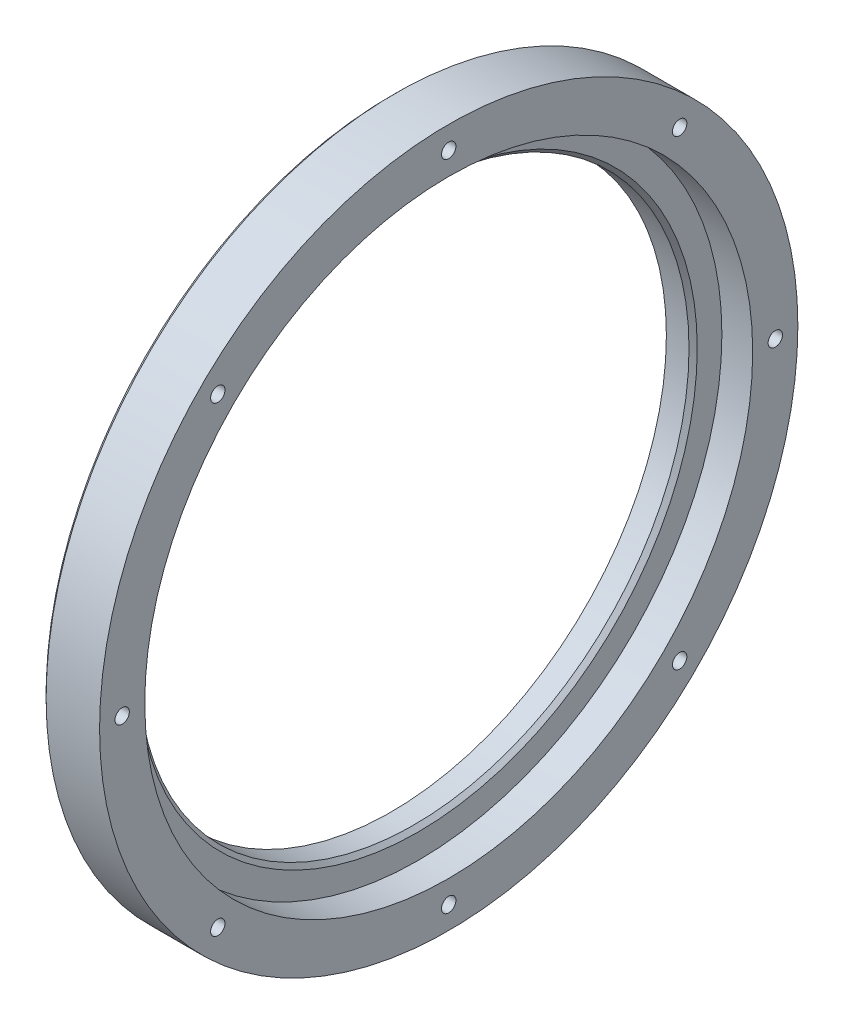
ISO-10303-21;
HEADER;
FILE_DESCRIPTION(('STEP AP214'),'2;1');
FILE_NAME('part.step','',(''),(''),'','','');
FILE_SCHEMA(('AUTOMOTIVE_DESIGN { 1 0 10303 214 1 1 1 1 }'));
ENDSEC;
DATA;
#1=APPLICATION_CONTEXT('core data for automotive mechanical design processes');
#2=APPLICATION_PROTOCOL_DEFINITION('international standard','automotive_design',2000,#1);
#3=PRODUCT_CONTEXT('',#1,'mechanical');
#4=PRODUCT('Part','Part','',(#3));
#5=PRODUCT_RELATED_PRODUCT_CATEGORY('part','',(#4));
#6=PRODUCT_DEFINITION_FORMATION('','',#4);
#7=PRODUCT_DEFINITION_CONTEXT('part definition',#1,'design');
#8=PRODUCT_DEFINITION('design','',#6,#7);
#9=PRODUCT_DEFINITION_SHAPE('','',#8);
#10=(LENGTH_UNIT() NAMED_UNIT(*) SI_UNIT(.MILLI.,.METRE.));
#11=(NAMED_UNIT(*) PLANE_ANGLE_UNIT() SI_UNIT($,.RADIAN.));
#12=(NAMED_UNIT(*) SI_UNIT($,.STERADIAN.) SOLID_ANGLE_UNIT());
#13=UNCERTAINTY_MEASURE_WITH_UNIT(LENGTH_MEASURE(1.E-05),#10,'distance_accuracy_value','');
#14=(GEOMETRIC_REPRESENTATION_CONTEXT(3) GLOBAL_UNCERTAINTY_ASSIGNED_CONTEXT((#13)) GLOBAL_UNIT_ASSIGNED_CONTEXT((#10,
#11,#12)) REPRESENTATION_CONTEXT('',''));
#15=CARTESIAN_POINT('',(0.,0.,0.));
#16=DIRECTION('',(0.,0.,1.));
#17=DIRECTION('',(1.,0.,0.));
#18=AXIS2_PLACEMENT_3D('',#15,#16,#17);
#19=CARTESIAN_POINT('',(-272.858046522507,57.2242590790327,56.2149891043305));
#20=DIRECTION('',(-1.,0.,0.));
#21=DIRECTION('',(0.,0.,1.));
#22=AXIS2_PLACEMENT_3D('',#19,#20,#21);
#23=CYLINDRICAL_SURFACE('',#22,1.75000000000001);
#24=CARTESIAN_POINT('',(-272.858046522507,57.2242590790327,56.2149891043305));
#25=DIRECTION('',(-1.,0.,0.));
#26=DIRECTION('',(0.,0.,1.));
#27=AXIS2_PLACEMENT_3D('',#24,#25,#26);
#28=CIRCLE('',#27,1.75000000000001);
#29=CARTESIAN_POINT('',(-272.858046522507,57.2242590790327,57.9649891043306));
#30=VERTEX_POINT('',#29);
#31=EDGE_CURVE('E116',#30,#30,#28,.T.);
#32=ORIENTED_EDGE('',*,*,#31,.F.);
#33=EDGE_LOOP('',(#32));
#34=FACE_BOUND('',#33,.T.);
#35=CARTESIAN_POINT('',(-282.871214875946,57.2242590790327,56.2149891043305));
#36=DIRECTION('',(-1.,0.,0.));
#37=DIRECTION('',(0.,0.,1.));
#38=AXIS2_PLACEMENT_3D('',#35,#36,#37);
#39=CIRCLE('',#38,1.75000000000001);
#40=CARTESIAN_POINT('',(-282.871214875946,57.2242590790327,57.9649891043306));
#41=VERTEX_POINT('',#40);
#42=EDGE_CURVE('E72',#41,#41,#39,.F.);
#43=ORIENTED_EDGE('',*,*,#42,.F.);
#44=EDGE_LOOP('',(#43));
#45=FACE_BOUND('',#44,.T.);
#46=ADVANCED_FACE('F48',(#34,#45),#23,.F.);
#47=CARTESIAN_POINT('',(-272.858046522507,80.5092699747022,0.));
#48=DIRECTION('',(-1.,0.,0.));
#49=DIRECTION('',(0.,0.,1.));
#50=AXIS2_PLACEMENT_3D('',#47,#48,#49);
#51=CYLINDRICAL_SURFACE('',#50,1.75000000000001);
#52=CARTESIAN_POINT('',(-272.858046522507,80.5092699747022,0.));
#53=DIRECTION('',(-1.,0.,0.));
#54=DIRECTION('',(0.,0.,1.));
#55=AXIS2_PLACEMENT_3D('',#52,#53,#54);
#56=CIRCLE('',#55,1.75000000000001);
#57=CARTESIAN_POINT('',(-272.858046522507,80.5092699747022,1.75000000000001));
#58=VERTEX_POINT('',#57);
#59=EDGE_CURVE('E162',#58,#58,#56,.T.);
#60=ORIENTED_EDGE('',*,*,#59,.F.);
#61=EDGE_LOOP('',(#60));
#62=FACE_BOUND('',#61,.T.);
#63=CARTESIAN_POINT('',(-282.871214875946,80.5092699747022,0.));
#64=DIRECTION('',(-1.,0.,0.));
#65=DIRECTION('',(0.,0.,1.));
#66=AXIS2_PLACEMENT_3D('',#63,#64,#65);
#67=CIRCLE('',#66,1.75000000000001);
#68=CARTESIAN_POINT('',(-282.871214875946,80.5092699747022,1.75000000000001));
#69=VERTEX_POINT('',#68);
#70=EDGE_CURVE('E77',#69,#69,#67,.F.);
#71=ORIENTED_EDGE('',*,*,#70,.F.);
#72=EDGE_LOOP('',(#71));
#73=FACE_BOUND('',#72,.T.);
#74=ADVANCED_FACE('F283',(#62,#73),#51,.F.);
#75=CARTESIAN_POINT('',(-272.858046522507,57.2242590790327,-56.2149891043305));
#76=DIRECTION('',(-1.,0.,0.));
#77=DIRECTION('',(0.,0.,1.));
#78=AXIS2_PLACEMENT_3D('',#75,#76,#77);
#79=CYLINDRICAL_SURFACE('',#78,1.75000000000001);
#80=CARTESIAN_POINT('',(-272.858046522507,57.2242590790327,-56.2149891043305));
#81=DIRECTION('',(-1.,0.,0.));
#82=DIRECTION('',(0.,0.,1.));
#83=AXIS2_PLACEMENT_3D('',#80,#81,#82);
#84=CIRCLE('',#83,1.75000000000001);
#85=CARTESIAN_POINT('',(-272.858046522507,57.2242590790327,-54.4649891043305));
#86=VERTEX_POINT('',#85);
#87=EDGE_CURVE('E158',#86,#86,#84,.T.);
#88=ORIENTED_EDGE('',*,*,#87,.F.);
#89=EDGE_LOOP('',(#88));
#90=FACE_BOUND('',#89,.T.);
#91=CARTESIAN_POINT('',(-282.871214875946,57.2242590790327,-56.2149891043305));
#92=DIRECTION('',(-1.,0.,0.));
#93=DIRECTION('',(0.,0.,1.));
#94=AXIS2_PLACEMENT_3D('',#91,#92,#93);
#95=CIRCLE('',#94,1.75000000000001);
#96=CARTESIAN_POINT('',(-282.871214875946,57.2242590790327,-54.4649891043305));
#97=VERTEX_POINT('',#96);
#98=EDGE_CURVE('E83',#97,#97,#95,.F.);
#99=ORIENTED_EDGE('',*,*,#98,.F.);
#100=EDGE_LOOP('',(#99));
#101=FACE_BOUND('',#100,.T.);
#102=ADVANCED_FACE('F289',(#90,#101),#79,.F.);
#103=CARTESIAN_POINT('',(-272.858046522507,1.00926997470218,-79.5));
#104=DIRECTION('',(-1.,0.,0.));
#105=DIRECTION('',(0.,0.,1.));
#106=AXIS2_PLACEMENT_3D('',#103,#104,#105);
#107=CYLINDRICAL_SURFACE('',#106,1.75);
#108=CARTESIAN_POINT('',(-272.858046522507,1.00926997470218,-79.5));
#109=DIRECTION('',(-1.,0.,0.));
#110=DIRECTION('',(0.,0.,1.));
#111=AXIS2_PLACEMENT_3D('',#108,#109,#110);
#112=CIRCLE('',#111,1.75);
#113=CARTESIAN_POINT('',(-272.858046522507,1.00926997470218,-77.75));
#114=VERTEX_POINT('',#113);
#115=EDGE_CURVE('E154',#114,#114,#112,.T.);
#116=ORIENTED_EDGE('',*,*,#115,.F.);
#117=EDGE_LOOP('',(#116));
#118=FACE_BOUND('',#117,.T.);
#119=CARTESIAN_POINT('',(-282.871214875946,1.00926997470218,-79.5));
#120=DIRECTION('',(-1.,0.,0.));
#121=DIRECTION('',(0.,0.,1.));
#122=AXIS2_PLACEMENT_3D('',#119,#120,#121);
#123=CIRCLE('',#122,1.75);
#124=CARTESIAN_POINT('',(-282.871214875946,1.00926997470218,-77.75));
#125=VERTEX_POINT('',#124);
#126=EDGE_CURVE('E89',#125,#125,#123,.F.);
#127=ORIENTED_EDGE('',*,*,#126,.F.);
#128=EDGE_LOOP('',(#127));
#129=FACE_BOUND('',#128,.T.);
#130=ADVANCED_FACE('F300',(#118,#129),#107,.F.);
#131=CARTESIAN_POINT('',(-272.858046522507,-55.2057191296284,-56.2149891043306));
#132=DIRECTION('',(-1.,0.,0.));
#133=DIRECTION('',(0.,0.,1.));
#134=AXIS2_PLACEMENT_3D('',#131,#132,#133);
#135=CYLINDRICAL_SURFACE('',#134,1.75000000000001);
#136=CARTESIAN_POINT('',(-272.858046522507,-55.2057191296284,-56.2149891043306));
#137=DIRECTION('',(-1.,0.,0.));
#138=DIRECTION('',(0.,0.,1.));
#139=AXIS2_PLACEMENT_3D('',#136,#137,#138);
#140=CIRCLE('',#139,1.75000000000001);
#141=CARTESIAN_POINT('',(-272.858046522507,-55.2057191296284,-54.4649891043305));
#142=VERTEX_POINT('',#141);
#143=EDGE_CURVE('E150',#142,#142,#140,.T.);
#144=ORIENTED_EDGE('',*,*,#143,.F.);
#145=EDGE_LOOP('',(#144));
#146=FACE_BOUND('',#145,.T.);
#147=CARTESIAN_POINT('',(-282.871214875946,-55.2057191296284,-56.2149891043306));
#148=DIRECTION('',(-1.,0.,0.));
#149=DIRECTION('',(0.,0.,1.));
#150=AXIS2_PLACEMENT_3D('',#147,#148,#149);
#151=CIRCLE('',#150,1.75000000000001);
#152=CARTESIAN_POINT('',(-282.871214875946,-55.2057191296284,-54.4649891043305));
#153=VERTEX_POINT('',#152);
#154=EDGE_CURVE('E95',#153,#153,#151,.F.);
#155=ORIENTED_EDGE('',*,*,#154,.F.);
#156=EDGE_LOOP('',(#155));
#157=FACE_BOUND('',#156,.T.);
#158=ADVANCED_FACE('F304',(#146,#157),#135,.F.);
#159=CARTESIAN_POINT('',(-272.858046522507,-78.4907300252979,0.));
#160=DIRECTION('',(-1.,0.,0.));
#161=DIRECTION('',(0.,0.,1.));
#162=AXIS2_PLACEMENT_3D('',#159,#160,#161);
#163=CYLINDRICAL_SURFACE('',#162,1.75000000000001);
#164=CARTESIAN_POINT('',(-272.858046522507,-78.4907300252979,0.));
#165=DIRECTION('',(-1.,0.,0.));
#166=DIRECTION('',(0.,0.,1.));
#167=AXIS2_PLACEMENT_3D('',#164,#165,#166);
#168=CIRCLE('',#167,1.75000000000001);
#169=CARTESIAN_POINT('',(-272.858046522507,-78.4907300252979,1.75));
#170=VERTEX_POINT('',#169);
#171=EDGE_CURVE('E146',#170,#170,#168,.T.);
#172=ORIENTED_EDGE('',*,*,#171,.F.);
#173=EDGE_LOOP('',(#172));
#174=FACE_BOUND('',#173,.T.);
#175=CARTESIAN_POINT('',(-282.871214875946,-78.4907300252979,0.));
#176=DIRECTION('',(-1.,0.,0.));
#177=DIRECTION('',(0.,0.,1.));
#178=AXIS2_PLACEMENT_3D('',#175,#176,#177);
#179=CIRCLE('',#178,1.75000000000001);
#180=CARTESIAN_POINT('',(-282.871214875946,-78.4907300252979,1.75));
#181=VERTEX_POINT('',#180);
#182=EDGE_CURVE('E101',#181,#181,#179,.F.);
#183=ORIENTED_EDGE('',*,*,#182,.F.);
#184=EDGE_LOOP('',(#183));
#185=FACE_BOUND('',#184,.T.);
#186=ADVANCED_FACE('F308',(#174,#185),#163,.F.);
#187=CARTESIAN_POINT('',(-272.858046522507,-55.2057191296284,56.2149891043305));
#188=DIRECTION('',(-1.,0.,0.));
#189=DIRECTION('',(0.,0.,1.));
#190=AXIS2_PLACEMENT_3D('',#187,#188,#189);
#191=CYLINDRICAL_SURFACE('',#190,1.75000000000001);
#192=CARTESIAN_POINT('',(-272.858046522507,-55.2057191296284,56.2149891043305));
#193=DIRECTION('',(-1.,0.,0.));
#194=DIRECTION('',(0.,0.,1.));
#195=AXIS2_PLACEMENT_3D('',#192,#193,#194);
#196=CIRCLE('',#195,1.75000000000001);
#197=CARTESIAN_POINT('',(-272.858046522507,-55.2057191296284,57.9649891043306));
#198=VERTEX_POINT('',#197);
#199=EDGE_CURVE('E142',#198,#198,#196,.T.);
#200=ORIENTED_EDGE('',*,*,#199,.F.);
#201=EDGE_LOOP('',(#200));
#202=FACE_BOUND('',#201,.T.);
#203=CARTESIAN_POINT('',(-282.871214875946,-55.2057191296284,56.2149891043305));
#204=DIRECTION('',(-1.,0.,0.));
#205=DIRECTION('',(0.,0.,1.));
#206=AXIS2_PLACEMENT_3D('',#203,#204,#205);
#207=CIRCLE('',#206,1.75000000000001);
#208=CARTESIAN_POINT('',(-282.871214875946,-55.2057191296284,57.9649891043306));
#209=VERTEX_POINT('',#208);
#210=EDGE_CURVE('E107',#209,#209,#207,.F.);
#211=ORIENTED_EDGE('',*,*,#210,.F.);
#212=EDGE_LOOP('',(#211));
#213=FACE_BOUND('',#212,.T.);
#214=ADVANCED_FACE('F312',(#202,#213),#191,.F.);
#215=CARTESIAN_POINT('',(-272.858046522507,1.00926997470216,79.5));
#216=DIRECTION('',(-1.,0.,0.));
#217=DIRECTION('',(0.,0.,1.));
#218=AXIS2_PLACEMENT_3D('',#215,#216,#217);
#219=CYLINDRICAL_SURFACE('',#218,1.75000000000001);
#220=CARTESIAN_POINT('',(-272.858046522507,1.00926997470216,79.5));
#221=DIRECTION('',(-1.,0.,0.));
#222=DIRECTION('',(0.,0.,1.));
#223=AXIS2_PLACEMENT_3D('',#220,#221,#222);
#224=CIRCLE('',#223,1.75000000000001);
#225=CARTESIAN_POINT('',(-272.858046522507,1.00926997470216,81.25));
#226=VERTEX_POINT('',#225);
#227=EDGE_CURVE('E138',#226,#226,#224,.T.);
#228=ORIENTED_EDGE('',*,*,#227,.F.);
#229=EDGE_LOOP('',(#228));
#230=FACE_BOUND('',#229,.T.);
#231=CARTESIAN_POINT('',(-282.871214875946,1.00926997470216,79.5));
#232=DIRECTION('',(-1.,0.,0.));
#233=DIRECTION('',(0.,0.,1.));
#234=AXIS2_PLACEMENT_3D('',#231,#232,#233);
#235=CIRCLE('',#234,1.75000000000001);
#236=CARTESIAN_POINT('',(-282.871214875946,1.00926997470216,81.25));
#237=VERTEX_POINT('',#236);
#238=EDGE_CURVE('E113',#237,#237,#235,.F.);
#239=ORIENTED_EDGE('',*,*,#238,.F.);
#240=EDGE_LOOP('',(#239));
#241=FACE_BOUND('',#240,.T.);
#242=ADVANCED_FACE('F266',(#230,#241),#219,.F.);
#243=CARTESIAN_POINT('',(-272.858046522507,75.0092699747022,0.));
#244=DIRECTION('',(1.,0.,0.));
#245=DIRECTION('',(0.,0.,-1.));
#246=AXIS2_PLACEMENT_3D('',#243,#244,#245);
#247=PLANE('',#246);
#248=ORIENTED_EDGE('',*,*,#31,.T.);
#249=EDGE_LOOP('',(#248));
#250=FACE_BOUND('',#249,.T.);
#251=ORIENTED_EDGE('',*,*,#59,.T.);
#252=EDGE_LOOP('',(#251));
#253=FACE_BOUND('',#252,.T.);
#254=ORIENTED_EDGE('',*,*,#87,.T.);
#255=EDGE_LOOP('',(#254));
#256=FACE_BOUND('',#255,.T.);
#257=ORIENTED_EDGE('',*,*,#115,.T.);
#258=EDGE_LOOP('',(#257));
#259=FACE_BOUND('',#258,.T.);
#260=ORIENTED_EDGE('',*,*,#143,.T.);
#261=EDGE_LOOP('',(#260));
#262=FACE_BOUND('',#261,.T.);
#263=ORIENTED_EDGE('',*,*,#171,.T.);
#264=EDGE_LOOP('',(#263));
#265=FACE_BOUND('',#264,.T.);
#266=ORIENTED_EDGE('',*,*,#199,.T.);
#267=EDGE_LOOP('',(#266));
#268=FACE_BOUND('',#267,.T.);
#269=ORIENTED_EDGE('',*,*,#227,.T.);
#270=EDGE_LOOP('',(#269));
#271=FACE_BOUND('',#270,.T.);
#272=CARTESIAN_POINT('',(-272.858046522507,1.00926997470217,0.));
#273=DIRECTION('',(1.,0.,0.));
#274=DIRECTION('',(0.,0.,-1.));
#275=AXIS2_PLACEMENT_3D('',#272,#273,#274);
#276=CIRCLE('',#275,85.);
#277=CARTESIAN_POINT('',(-272.858046522507,1.00926997470217,-85.));
#278=VERTEX_POINT('',#277);
#279=EDGE_CURVE('E134',#278,#278,#276,.T.);
#280=ORIENTED_EDGE('',*,*,#279,.T.);
#281=EDGE_LOOP('',(#280));
#282=FACE_BOUND('',#281,.T.);
#283=CARTESIAN_POINT('',(-272.858046522507,1.00926997470217,0.));
#284=DIRECTION('',(1.,0.,0.));
#285=DIRECTION('',(0.,0.,-1.));
#286=AXIS2_PLACEMENT_3D('',#283,#284,#285);
#287=CIRCLE('',#286,74.);
#288=CARTESIAN_POINT('',(-272.858046522507,1.00926997470217,-74.));
#289=VERTEX_POINT('',#288);
#290=EDGE_CURVE('E63',#289,#289,#287,.T.);
#291=ORIENTED_EDGE('',*,*,#290,.F.);
#292=EDGE_LOOP('',(#291));
#293=FACE_BOUND('',#292,.T.);
#294=ADVANCED_FACE('F262',(#250,#253,#256,#259,#262,#265,#268,#271,#282,#293),#247,.T.);
#295=CARTESIAN_POINT('',(-268.908046522507,1.00926997470217,0.));
#296=DIRECTION('',(1.,0.,0.));
#297=DIRECTION('',(0.,0.,-1.));
#298=AXIS2_PLACEMENT_3D('',#295,#296,#297);
#299=CYLINDRICAL_SURFACE('',#298,74.);
#300=ORIENTED_EDGE('',*,*,#290,.T.);
#301=EDGE_LOOP('',(#300));
#302=FACE_BOUND('',#301,.T.);
#303=CARTESIAN_POINT('',(-280.358046522507,1.00926997470217,0.));
#304=DIRECTION('',(1.,0.,0.));
#305=DIRECTION('',(0.,0.,-1.));
#306=AXIS2_PLACEMENT_3D('',#303,#304,#305);
#307=CIRCLE('',#306,74.);
#308=CARTESIAN_POINT('',(-280.358046522507,1.00926997470217,-74.));
#309=VERTEX_POINT('',#308);
#310=EDGE_CURVE('E69',#309,#309,#307,.T.);
#311=ORIENTED_EDGE('',*,*,#310,.F.);
#312=EDGE_LOOP('',(#311));
#313=FACE_BOUND('',#312,.T.);
#314=ADVANCED_FACE('F265',(#302,#313),#299,.F.);
#315=CARTESIAN_POINT('',(-280.358046522507,75.0092699747022,0.));
#316=DIRECTION('',(1.,0.,0.));
#317=DIRECTION('',(0.,0.,-1.));
#318=AXIS2_PLACEMENT_3D('',#315,#316,#317);
#319=PLANE('',#318);
#320=CARTESIAN_POINT('',(-280.358046522507,1.00926997470217,0.));
#321=DIRECTION('',(1.,0.,0.));
#322=DIRECTION('',(0.,0.,-1.));
#323=AXIS2_PLACEMENT_3D('',#320,#321,#322);
#324=CIRCLE('',#323,68.);
#325=CARTESIAN_POINT('',(-280.358046522507,1.00926997470217,-68.));
#326=VERTEX_POINT('',#325);
#327=EDGE_CURVE('E12',#326,#326,#324,.F.);
#328=ORIENTED_EDGE('',*,*,#327,.T.);
#329=EDGE_LOOP('',(#328));
#330=FACE_BOUND('',#329,.T.);
#331=ORIENTED_EDGE('',*,*,#310,.T.);
#332=EDGE_LOOP('',(#331));
#333=FACE_BOUND('',#332,.T.);
#334=ADVANCED_FACE('F272',(#330,#333),#319,.T.);
#335=CARTESIAN_POINT('',(-268.908046522507,1.00926997470217,0.));
#336=DIRECTION('',(1.,0.,0.));
#337=DIRECTION('',(0.,0.,-1.));
#338=AXIS2_PLACEMENT_3D('',#335,#336,#337);
#339=CYLINDRICAL_SURFACE('',#338,67.);
#340=CARTESIAN_POINT('',(-281.358046522507,1.00926997470217,0.));
#341=DIRECTION('',(1.,0.,0.));
#342=DIRECTION('',(0.,0.,-1.));
#343=AXIS2_PLACEMENT_3D('',#340,#341,#342);
#344=CIRCLE('',#343,67.);
#345=CARTESIAN_POINT('',(-281.358046522507,1.00926997470217,-67.));
#346=VERTEX_POINT('',#345);
#347=EDGE_CURVE('E56',#346,#346,#344,.T.);
#348=ORIENTED_EDGE('',*,*,#347,.T.);
#349=EDGE_LOOP('',(#348));
#350=FACE_BOUND('',#349,.T.);
#351=CARTESIAN_POINT('',(-286.871214875946,1.00926997470217,0.));
#352=DIRECTION('',(1.,0.,0.));
#353=DIRECTION('',(0.,0.,-1.));
#354=AXIS2_PLACEMENT_3D('',#351,#352,#353);
#355=CIRCLE('',#354,67.);
#356=CARTESIAN_POINT('',(-286.871214875946,1.00926997470217,-67.));
#357=VERTEX_POINT('',#356);
#358=EDGE_CURVE('E122',#357,#357,#355,.T.);
#359=ORIENTED_EDGE('',*,*,#358,.F.);
#360=EDGE_LOOP('',(#359));
#361=FACE_BOUND('',#360,.T.);
#362=ADVANCED_FACE('F230',(#350,#361),#339,.F.);
#363=CARTESIAN_POINT('',(-286.871214875946,68.0092699747022,0.));
#364=DIRECTION('',(-1.,0.,0.));
#365=DIRECTION('',(0.,0.,1.));
#366=AXIS2_PLACEMENT_3D('',#363,#364,#365);
#367=PLANE('',#366);
#368=CARTESIAN_POINT('',(-286.871214875946,57.2242590790327,56.2149891043305));
#369=DIRECTION('',(-1.,0.,0.));
#370=DIRECTION('',(0.,0.,1.));
#371=AXIS2_PLACEMENT_3D('',#368,#369,#370);
#372=CIRCLE('',#371,3.00000000000002);
#373=CARTESIAN_POINT('',(-286.871214875946,57.2242590790327,59.2149891043306));
#374=VERTEX_POINT('',#373);
#375=EDGE_CURVE('E209',#374,#374,#372,.T.);
#376=ORIENTED_EDGE('',*,*,#375,.F.);
#377=EDGE_LOOP('',(#376));
#378=FACE_BOUND('',#377,.T.);
#379=CARTESIAN_POINT('',(-286.871214875946,80.5092699747022,0.));
#380=DIRECTION('',(-1.,0.,0.));
#381=DIRECTION('',(0.,0.,1.));
#382=AXIS2_PLACEMENT_3D('',#379,#380,#381);
#383=CIRCLE('',#382,3.00000000000001);
#384=CARTESIAN_POINT('',(-286.871214875946,80.5092699747022,3.00000000000001));
#385=VERTEX_POINT('',#384);
#386=EDGE_CURVE('E75',#385,#385,#383,.T.);
#387=ORIENTED_EDGE('',*,*,#386,.F.);
#388=EDGE_LOOP('',(#387));
#389=FACE_BOUND('',#388,.T.);
#390=CARTESIAN_POINT('',(-286.871214875946,57.2242590790327,-56.2149891043305));
#391=DIRECTION('',(-1.,0.,0.));
#392=DIRECTION('',(0.,0.,1.));
#393=AXIS2_PLACEMENT_3D('',#390,#391,#392);
#394=CIRCLE('',#393,3.00000000000001);
#395=CARTESIAN_POINT('',(-286.871214875946,57.2242590790327,-53.2149891043305));
#396=VERTEX_POINT('',#395);
#397=EDGE_CURVE('E81',#396,#396,#394,.T.);
#398=ORIENTED_EDGE('',*,*,#397,.F.);
#399=EDGE_LOOP('',(#398));
#400=FACE_BOUND('',#399,.T.);
#401=CARTESIAN_POINT('',(-286.871214875946,1.00926997470217,-79.5));
#402=DIRECTION('',(-1.,0.,0.));
#403=DIRECTION('',(0.,0.,1.));
#404=AXIS2_PLACEMENT_3D('',#401,#402,#403);
#405=CIRCLE('',#404,3.00000000000002);
#406=CARTESIAN_POINT('',(-286.871214875946,1.00926997470217,-76.5));
#407=VERTEX_POINT('',#406);
#408=EDGE_CURVE('E87',#407,#407,#405,.T.);
#409=ORIENTED_EDGE('',*,*,#408,.F.);
#410=EDGE_LOOP('',(#409));
#411=FACE_BOUND('',#410,.T.);
#412=CARTESIAN_POINT('',(-286.871214875946,-55.2057191296284,-56.2149891043306));
#413=DIRECTION('',(-1.,0.,0.));
#414=DIRECTION('',(0.,0.,1.));
#415=AXIS2_PLACEMENT_3D('',#412,#413,#414);
#416=CIRCLE('',#415,3.00000000000001);
#417=CARTESIAN_POINT('',(-286.871214875946,-55.2057191296284,-53.2149891043305));
#418=VERTEX_POINT('',#417);
#419=EDGE_CURVE('E93',#418,#418,#416,.T.);
#420=ORIENTED_EDGE('',*,*,#419,.F.);
#421=EDGE_LOOP('',(#420));
#422=FACE_BOUND('',#421,.T.);
#423=CARTESIAN_POINT('',(-286.871214875946,-78.4907300252979,0.));
#424=DIRECTION('',(-1.,0.,0.));
#425=DIRECTION('',(0.,0.,1.));
#426=AXIS2_PLACEMENT_3D('',#423,#424,#425);
#427=CIRCLE('',#426,3.00000000000002);
#428=CARTESIAN_POINT('',(-286.871214875946,-78.4907300252979,3.00000000000001));
#429=VERTEX_POINT('',#428);
#430=EDGE_CURVE('E99',#429,#429,#427,.T.);
#431=ORIENTED_EDGE('',*,*,#430,.F.);
#432=EDGE_LOOP('',(#431));
#433=FACE_BOUND('',#432,.T.);
#434=CARTESIAN_POINT('',(-286.871214875946,-55.2057191296284,56.2149891043305));
#435=DIRECTION('',(-1.,0.,0.));
#436=DIRECTION('',(0.,0.,1.));
#437=AXIS2_PLACEMENT_3D('',#434,#435,#436);
#438=CIRCLE('',#437,3.00000000000002);
#439=CARTESIAN_POINT('',(-286.871214875946,-55.2057191296284,59.2149891043306));
#440=VERTEX_POINT('',#439);
#441=EDGE_CURVE('E105',#440,#440,#438,.T.);
#442=ORIENTED_EDGE('',*,*,#441,.F.);
#443=EDGE_LOOP('',(#442));
#444=FACE_BOUND('',#443,.T.);
#445=CARTESIAN_POINT('',(-286.871214875946,1.00926997470216,79.5));
#446=DIRECTION('',(-1.,0.,0.));
#447=DIRECTION('',(0.,0.,1.));
#448=AXIS2_PLACEMENT_3D('',#445,#446,#447);
#449=CIRCLE('',#448,3.00000000000002);
#450=CARTESIAN_POINT('',(-286.871214875946,1.00926997470216,82.5));
#451=VERTEX_POINT('',#450);
#452=EDGE_CURVE('E111',#451,#451,#449,.T.);
#453=ORIENTED_EDGE('',*,*,#452,.F.);
#454=EDGE_LOOP('',(#453));
#455=FACE_BOUND('',#454,.T.);
#456=ORIENTED_EDGE('',*,*,#358,.T.);
#457=EDGE_LOOP('',(#456));
#458=FACE_BOUND('',#457,.T.);
#459=CARTESIAN_POINT('',(-286.871214875946,1.00926997470217,0.));
#460=DIRECTION('',(1.,0.,0.));
#461=DIRECTION('',(0.,0.,-1.));
#462=AXIS2_PLACEMENT_3D('',#459,#460,#461);
#463=CIRCLE('',#462,84.);
#464=CARTESIAN_POINT('',(-286.871214875946,1.00926997470217,-84.));
#465=VERTEX_POINT('',#464);
#466=EDGE_CURVE('E126',#465,#465,#463,.T.);
#467=ORIENTED_EDGE('',*,*,#466,.F.);
#468=EDGE_LOOP('',(#467));
#469=FACE_BOUND('',#468,.T.);
#470=ADVANCED_FACE('F226',(#378,#389,#400,#411,#422,#433,#444,#455,#458,#469),#367,.T.);
#471=CARTESIAN_POINT('',(-285.871214875946,1.00926997470217,0.));
#472=DIRECTION('',(1.,0.,0.));
#473=DIRECTION('',(0.,0.,-1.));
#474=AXIS2_PLACEMENT_3D('',#471,#472,#473);
#475=CONICAL_SURFACE('',#474,85.,0.785398163397448);
#476=ORIENTED_EDGE('',*,*,#466,.T.);
#477=EDGE_LOOP('',(#476));
#478=FACE_BOUND('',#477,.T.);
#479=CARTESIAN_POINT('',(-285.871214875946,1.00926997470217,0.));
#480=DIRECTION('',(1.,0.,0.));
#481=DIRECTION('',(0.,0.,-1.));
#482=AXIS2_PLACEMENT_3D('',#479,#480,#481);
#483=CIRCLE('',#482,85.);
#484=CARTESIAN_POINT('',(-285.871214875946,1.00926997470217,-85.));
#485=VERTEX_POINT('',#484);
#486=EDGE_CURVE('E130',#485,#485,#483,.T.);
#487=ORIENTED_EDGE('',*,*,#486,.F.);
#488=EDGE_LOOP('',(#487));
#489=FACE_BOUND('',#488,.T.);
#490=ADVANCED_FACE('F229',(#478,#489),#475,.T.);
#491=CARTESIAN_POINT('',(-268.908046522507,1.00926997470217,0.));
#492=DIRECTION('',(1.,0.,0.));
#493=DIRECTION('',(0.,0.,-1.));
#494=AXIS2_PLACEMENT_3D('',#491,#492,#493);
#495=CYLINDRICAL_SURFACE('',#494,85.);
#496=ORIENTED_EDGE('',*,*,#486,.T.);
#497=EDGE_LOOP('',(#496));
#498=FACE_BOUND('',#497,.T.);
#499=ORIENTED_EDGE('',*,*,#279,.F.);
#500=EDGE_LOOP('',(#499));
#501=FACE_BOUND('',#500,.T.);
#502=ADVANCED_FACE('F252',(#498,#501),#495,.T.);
#503=CARTESIAN_POINT('',(-282.871214875946,1.00926997470216,79.5));
#504=DIRECTION('',(-1.,0.,0.));
#505=DIRECTION('',(0.,0.,1.));
#506=AXIS2_PLACEMENT_3D('',#503,#504,#505);
#507=PLANE('',#506);
#508=CARTESIAN_POINT('',(-282.871214875946,1.00926997470216,79.5));
#509=DIRECTION('',(-1.,0.,0.));
#510=DIRECTION('',(0.,0.,1.));
#511=AXIS2_PLACEMENT_3D('',#508,#509,#510);
#512=CIRCLE('',#511,3.00000000000002);
#513=CARTESIAN_POINT('',(-282.871214875946,1.00926997470216,82.5));
#514=VERTEX_POINT('',#513);
#515=EDGE_CURVE('E117',#514,#514,#512,.T.);
#516=ORIENTED_EDGE('',*,*,#515,.T.);
#517=EDGE_LOOP('',(#516));
#518=FACE_BOUND('',#517,.T.);
#519=ORIENTED_EDGE('',*,*,#238,.T.);
#520=EDGE_LOOP('',(#519));
#521=FACE_BOUND('',#520,.T.);
#522=ADVANCED_FACE('F258',(#518,#521),#507,.T.);
#523=CARTESIAN_POINT('',(-282.871214875946,1.00926997470216,79.5));
#524=DIRECTION('',(-1.,0.,0.));
#525=DIRECTION('',(0.,0.,1.));
#526=AXIS2_PLACEMENT_3D('',#523,#524,#525);
#527=CYLINDRICAL_SURFACE('',#526,3.00000000000002);
#528=ORIENTED_EDGE('',*,*,#515,.F.);
#529=EDGE_LOOP('',(#528));
#530=FACE_BOUND('',#529,.T.);
#531=ORIENTED_EDGE('',*,*,#452,.T.);
#532=EDGE_LOOP('',(#531));
#533=FACE_BOUND('',#532,.T.);
#534=ADVANCED_FACE('F295',(#530,#533),#527,.F.);
#535=CARTESIAN_POINT('',(-282.871214875946,-55.2057191296284,56.2149891043305));
#536=DIRECTION('',(-1.,0.,0.));
#537=DIRECTION('',(0.,0.,1.));
#538=AXIS2_PLACEMENT_3D('',#535,#536,#537);
#539=PLANE('',#538);
#540=CARTESIAN_POINT('',(-282.871214875946,-55.2057191296284,56.2149891043305));
#541=DIRECTION('',(-1.,0.,0.));
#542=DIRECTION('',(0.,0.,1.));
#543=AXIS2_PLACEMENT_3D('',#540,#541,#542);
#544=CIRCLE('',#543,3.00000000000002);
#545=CARTESIAN_POINT('',(-282.871214875946,-55.2057191296284,59.2149891043306));
#546=VERTEX_POINT('',#545);
#547=EDGE_CURVE('E112',#546,#546,#544,.T.);
#548=ORIENTED_EDGE('',*,*,#547,.T.);
#549=EDGE_LOOP('',(#548));
#550=FACE_BOUND('',#549,.T.);
#551=ORIENTED_EDGE('',*,*,#210,.T.);
#552=EDGE_LOOP('',(#551));
#553=FACE_BOUND('',#552,.T.);
#554=ADVANCED_FACE('F330',(#550,#553),#539,.T.);
#555=CARTESIAN_POINT('',(-282.871214875946,-55.2057191296284,56.2149891043305));
#556=DIRECTION('',(-1.,0.,0.));
#557=DIRECTION('',(0.,0.,1.));
#558=AXIS2_PLACEMENT_3D('',#555,#556,#557);
#559=CYLINDRICAL_SURFACE('',#558,3.00000000000002);
#560=ORIENTED_EDGE('',*,*,#547,.F.);
#561=EDGE_LOOP('',(#560));
#562=FACE_BOUND('',#561,.T.);
#563=ORIENTED_EDGE('',*,*,#441,.T.);
#564=EDGE_LOOP('',(#563));
#565=FACE_BOUND('',#564,.T.);
#566=ADVANCED_FACE('F333',(#562,#565),#559,.F.);
#567=CARTESIAN_POINT('',(-282.871214875946,-78.4907300252979,0.));
#568=DIRECTION('',(-1.,0.,0.));
#569=DIRECTION('',(0.,0.,1.));
#570=AXIS2_PLACEMENT_3D('',#567,#568,#569);
#571=PLANE('',#570);
#572=CARTESIAN_POINT('',(-282.871214875946,-78.4907300252979,0.));
#573=DIRECTION('',(-1.,0.,0.));
#574=DIRECTION('',(0.,0.,1.));
#575=AXIS2_PLACEMENT_3D('',#572,#573,#574);
#576=CIRCLE('',#575,3.00000000000002);
#577=CARTESIAN_POINT('',(-282.871214875946,-78.4907300252979,3.00000000000001));
#578=VERTEX_POINT('',#577);
#579=EDGE_CURVE('E106',#578,#578,#576,.T.);
#580=ORIENTED_EDGE('',*,*,#579,.T.);
#581=EDGE_LOOP('',(#580));
#582=FACE_BOUND('',#581,.T.);
#583=ORIENTED_EDGE('',*,*,#182,.T.);
#584=EDGE_LOOP('',(#583));
#585=FACE_BOUND('',#584,.T.);
#586=ADVANCED_FACE('F336',(#582,#585),#571,.T.);
#587=CARTESIAN_POINT('',(-282.871214875946,-78.4907300252979,0.));
#588=DIRECTION('',(-1.,0.,0.));
#589=DIRECTION('',(0.,0.,1.));
#590=AXIS2_PLACEMENT_3D('',#587,#588,#589);
#591=CYLINDRICAL_SURFACE('',#590,3.00000000000002);
#592=ORIENTED_EDGE('',*,*,#579,.F.);
#593=EDGE_LOOP('',(#592));
#594=FACE_BOUND('',#593,.T.);
#595=ORIENTED_EDGE('',*,*,#430,.T.);
#596=EDGE_LOOP('',(#595));
#597=FACE_BOUND('',#596,.T.);
#598=ADVANCED_FACE('F341',(#594,#597),#591,.F.);
#599=CARTESIAN_POINT('',(-282.871214875946,-55.2057191296284,-56.2149891043306));
#600=DIRECTION('',(-1.,0.,0.));
#601=DIRECTION('',(0.,0.,1.));
#602=AXIS2_PLACEMENT_3D('',#599,#600,#601);
#603=PLANE('',#602);
#604=CARTESIAN_POINT('',(-282.871214875946,-55.2057191296284,-56.2149891043306));
#605=DIRECTION('',(-1.,0.,0.));
#606=DIRECTION('',(0.,0.,1.));
#607=AXIS2_PLACEMENT_3D('',#604,#605,#606);
#608=CIRCLE('',#607,3.00000000000001);
#609=CARTESIAN_POINT('',(-282.871214875946,-55.2057191296284,-53.2149891043305));
#610=VERTEX_POINT('',#609);
#611=EDGE_CURVE('E100',#610,#610,#608,.T.);
#612=ORIENTED_EDGE('',*,*,#611,.T.);
#613=EDGE_LOOP('',(#612));
#614=FACE_BOUND('',#613,.T.);
#615=ORIENTED_EDGE('',*,*,#154,.T.);
#616=EDGE_LOOP('',(#615));
#617=FACE_BOUND('',#616,.T.);
#618=ADVANCED_FACE('F344',(#614,#617),#603,.T.);
#619=CARTESIAN_POINT('',(-282.871214875946,-55.2057191296284,-56.2149891043306));
#620=DIRECTION('',(-1.,0.,0.));
#621=DIRECTION('',(0.,0.,1.));
#622=AXIS2_PLACEMENT_3D('',#619,#620,#621);
#623=CYLINDRICAL_SURFACE('',#622,3.00000000000001);
#624=ORIENTED_EDGE('',*,*,#611,.F.);
#625=EDGE_LOOP('',(#624));
#626=FACE_BOUND('',#625,.T.);
#627=ORIENTED_EDGE('',*,*,#419,.T.);
#628=EDGE_LOOP('',(#627));
#629=FACE_BOUND('',#628,.T.);
#630=ADVANCED_FACE('F349',(#626,#629),#623,.F.);
#631=CARTESIAN_POINT('',(-282.871214875946,1.00926997470217,-79.5));
#632=DIRECTION('',(-1.,0.,0.));
#633=DIRECTION('',(0.,0.,1.));
#634=AXIS2_PLACEMENT_3D('',#631,#632,#633);
#635=PLANE('',#634);
#636=CARTESIAN_POINT('',(-282.871214875946,1.00926997470217,-79.5));
#637=DIRECTION('',(-1.,0.,0.));
#638=DIRECTION('',(0.,0.,1.));
#639=AXIS2_PLACEMENT_3D('',#636,#637,#638);
#640=CIRCLE('',#639,3.00000000000002);
#641=CARTESIAN_POINT('',(-282.871214875946,1.00926997470217,-76.5));
#642=VERTEX_POINT('',#641);
#643=EDGE_CURVE('E94',#642,#642,#640,.T.);
#644=ORIENTED_EDGE('',*,*,#643,.T.);
#645=EDGE_LOOP('',(#644));
#646=FACE_BOUND('',#645,.T.);
#647=ORIENTED_EDGE('',*,*,#126,.T.);
#648=EDGE_LOOP('',(#647));
#649=FACE_BOUND('',#648,.T.);
#650=ADVANCED_FACE('F352',(#646,#649),#635,.T.);
#651=CARTESIAN_POINT('',(-282.871214875946,1.00926997470217,-79.5));
#652=DIRECTION('',(-1.,0.,0.));
#653=DIRECTION('',(0.,0.,1.));
#654=AXIS2_PLACEMENT_3D('',#651,#652,#653);
#655=CYLINDRICAL_SURFACE('',#654,3.00000000000002);
#656=ORIENTED_EDGE('',*,*,#643,.F.);
#657=EDGE_LOOP('',(#656));
#658=FACE_BOUND('',#657,.T.);
#659=ORIENTED_EDGE('',*,*,#408,.T.);
#660=EDGE_LOOP('',(#659));
#661=FACE_BOUND('',#660,.T.);
#662=ADVANCED_FACE('F357',(#658,#661),#655,.F.);
#663=CARTESIAN_POINT('',(-282.871214875946,57.2242590790327,-56.2149891043305));
#664=DIRECTION('',(-1.,0.,0.));
#665=DIRECTION('',(0.,0.,1.));
#666=AXIS2_PLACEMENT_3D('',#663,#664,#665);
#667=PLANE('',#666);
#668=CARTESIAN_POINT('',(-282.871214875946,57.2242590790327,-56.2149891043305));
#669=DIRECTION('',(-1.,0.,0.));
#670=DIRECTION('',(0.,0.,1.));
#671=AXIS2_PLACEMENT_3D('',#668,#669,#670);
#672=CIRCLE('',#671,3.00000000000001);
#673=CARTESIAN_POINT('',(-282.871214875946,57.2242590790327,-53.2149891043305));
#674=VERTEX_POINT('',#673);
#675=EDGE_CURVE('E88',#674,#674,#672,.T.);
#676=ORIENTED_EDGE('',*,*,#675,.T.);
#677=EDGE_LOOP('',(#676));
#678=FACE_BOUND('',#677,.T.);
#679=ORIENTED_EDGE('',*,*,#98,.T.);
#680=EDGE_LOOP('',(#679));
#681=FACE_BOUND('',#680,.T.);
#682=ADVANCED_FACE('F360',(#678,#681),#667,.T.);
#683=CARTESIAN_POINT('',(-282.871214875946,57.2242590790327,-56.2149891043305));
#684=DIRECTION('',(-1.,0.,0.));
#685=DIRECTION('',(0.,0.,1.));
#686=AXIS2_PLACEMENT_3D('',#683,#684,#685);
#687=CYLINDRICAL_SURFACE('',#686,3.00000000000001);
#688=ORIENTED_EDGE('',*,*,#675,.F.);
#689=EDGE_LOOP('',(#688));
#690=FACE_BOUND('',#689,.T.);
#691=ORIENTED_EDGE('',*,*,#397,.T.);
#692=EDGE_LOOP('',(#691));
#693=FACE_BOUND('',#692,.T.);
#694=ADVANCED_FACE('F365',(#690,#693),#687,.F.);
#695=CARTESIAN_POINT('',(-282.871214875946,80.5092699747022,0.));
#696=DIRECTION('',(-1.,0.,0.));
#697=DIRECTION('',(0.,0.,1.));
#698=AXIS2_PLACEMENT_3D('',#695,#696,#697);
#699=PLANE('',#698);
#700=CARTESIAN_POINT('',(-282.871214875946,80.5092699747022,0.));
#701=DIRECTION('',(-1.,0.,0.));
#702=DIRECTION('',(0.,0.,1.));
#703=AXIS2_PLACEMENT_3D('',#700,#701,#702);
#704=CIRCLE('',#703,3.00000000000001);
#705=CARTESIAN_POINT('',(-282.871214875946,80.5092699747022,3.00000000000001));
#706=VERTEX_POINT('',#705);
#707=EDGE_CURVE('E82',#706,#706,#704,.T.);
#708=ORIENTED_EDGE('',*,*,#707,.T.);
#709=EDGE_LOOP('',(#708));
#710=FACE_BOUND('',#709,.T.);
#711=ORIENTED_EDGE('',*,*,#70,.T.);
#712=EDGE_LOOP('',(#711));
#713=FACE_BOUND('',#712,.T.);
#714=ADVANCED_FACE('F368',(#710,#713),#699,.T.);
#715=CARTESIAN_POINT('',(-282.871214875946,80.5092699747022,0.));
#716=DIRECTION('',(-1.,0.,0.));
#717=DIRECTION('',(0.,0.,1.));
#718=AXIS2_PLACEMENT_3D('',#715,#716,#717);
#719=CYLINDRICAL_SURFACE('',#718,3.00000000000001);
#720=ORIENTED_EDGE('',*,*,#707,.F.);
#721=EDGE_LOOP('',(#720));
#722=FACE_BOUND('',#721,.T.);
#723=ORIENTED_EDGE('',*,*,#386,.T.);
#724=EDGE_LOOP('',(#723));
#725=FACE_BOUND('',#724,.T.);
#726=ADVANCED_FACE('F373',(#722,#725),#719,.F.);
#727=CARTESIAN_POINT('',(-282.871214875946,57.2242590790327,56.2149891043305));
#728=DIRECTION('',(-1.,0.,0.));
#729=DIRECTION('',(0.,0.,1.));
#730=AXIS2_PLACEMENT_3D('',#727,#728,#729);
#731=PLANE('',#730);
#732=CARTESIAN_POINT('',(-282.871214875946,57.2242590790327,56.2149891043305));
#733=DIRECTION('',(-1.,0.,0.));
#734=DIRECTION('',(0.,0.,1.));
#735=AXIS2_PLACEMENT_3D('',#732,#733,#734);
#736=CIRCLE('',#735,3.00000000000002);
#737=CARTESIAN_POINT('',(-282.871214875946,57.2242590790327,59.2149891043306));
#738=VERTEX_POINT('',#737);
#739=EDGE_CURVE('E76',#738,#738,#736,.T.);
#740=ORIENTED_EDGE('',*,*,#739,.T.);
#741=EDGE_LOOP('',(#740));
#742=FACE_BOUND('',#741,.T.);
#743=ORIENTED_EDGE('',*,*,#42,.T.);
#744=EDGE_LOOP('',(#743));
#745=FACE_BOUND('',#744,.T.);
#746=ADVANCED_FACE('F217',(#742,#745),#731,.T.);
#747=CARTESIAN_POINT('',(-282.871214875946,57.2242590790327,56.2149891043305));
#748=DIRECTION('',(-1.,0.,0.));
#749=DIRECTION('',(0.,0.,1.));
#750=AXIS2_PLACEMENT_3D('',#747,#748,#749);
#751=CYLINDRICAL_SURFACE('',#750,3.00000000000002);
#752=ORIENTED_EDGE('',*,*,#739,.F.);
#753=EDGE_LOOP('',(#752));
#754=FACE_BOUND('',#753,.T.);
#755=ORIENTED_EDGE('',*,*,#375,.T.);
#756=EDGE_LOOP('',(#755));
#757=FACE_BOUND('',#756,.T.);
#758=ADVANCED_FACE('F220',(#754,#757),#751,.F.);
#759=CARTESIAN_POINT('',(-281.358046522507,1.00926997470217,0.));
#760=DIRECTION('',(1.,0.,0.));
#761=DIRECTION('',(0.,0.,-1.));
#762=AXIS2_PLACEMENT_3D('',#759,#760,#761);
#763=CONICAL_SURFACE('',#762,67.,0.785398163397455);
#764=ORIENTED_EDGE('',*,*,#327,.F.);
#765=EDGE_LOOP('',(#764));
#766=FACE_BOUND('',#765,.T.);
#767=ORIENTED_EDGE('',*,*,#347,.F.);
#768=EDGE_LOOP('',(#767));
#769=FACE_BOUND('',#768,.T.);
#770=ADVANCED_FACE('F50',(#766,#769),#763,.F.);
#771=CLOSED_SHELL('',(#46,#74,#102,#130,#158,#186,#214,#242,#294,#314,#334,#362,#470,#490,#502,
#522,#534,#554,#566,#586,#598,#618,#630,#650,#662,#682,#694,#714,#726,#746,#758,#770));
#772=MANIFOLD_SOLID_BREP('B2',#771);
#773=ADVANCED_BREP_SHAPE_REPRESENTATION('',(#18,#772),#14);
#774=SHAPE_DEFINITION_REPRESENTATION(#9,#773);
ENDSEC;
END-ISO-10303-21;
